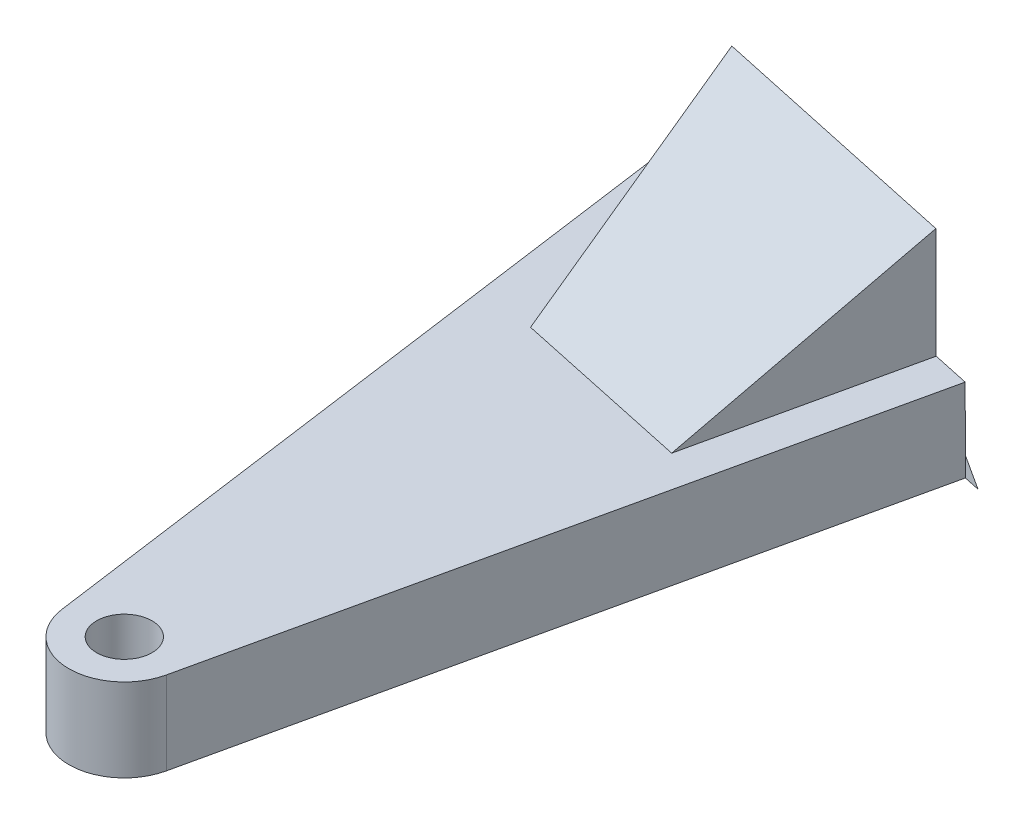
ISO-10303-21;
HEADER;
FILE_DESCRIPTION(('STEP AP214'),'2;1');
FILE_NAME('part.step','',(''),(''),'','','');
FILE_SCHEMA(('AUTOMOTIVE_DESIGN { 1 0 10303 214 1 1 1 1 }'));
ENDSEC;
DATA;
#1=APPLICATION_CONTEXT('core data for automotive mechanical design processes');
#2=APPLICATION_PROTOCOL_DEFINITION('international standard','automotive_design',2000,#1);
#3=PRODUCT_CONTEXT('',#1,'mechanical');
#4=PRODUCT('Part','Part','',(#3));
#5=PRODUCT_RELATED_PRODUCT_CATEGORY('part','',(#4));
#6=PRODUCT_DEFINITION_FORMATION('','',#4);
#7=PRODUCT_DEFINITION_CONTEXT('part definition',#1,'design');
#8=PRODUCT_DEFINITION('design','',#6,#7);
#9=PRODUCT_DEFINITION_SHAPE('','',#8);
#10=(LENGTH_UNIT() NAMED_UNIT(*) SI_UNIT(.MILLI.,.METRE.));
#11=(NAMED_UNIT(*) PLANE_ANGLE_UNIT() SI_UNIT($,.RADIAN.));
#12=(NAMED_UNIT(*) SI_UNIT($,.STERADIAN.) SOLID_ANGLE_UNIT());
#13=UNCERTAINTY_MEASURE_WITH_UNIT(LENGTH_MEASURE(1.E-05),#10,'distance_accuracy_value','');
#14=(GEOMETRIC_REPRESENTATION_CONTEXT(3) GLOBAL_UNCERTAINTY_ASSIGNED_CONTEXT((#13)) GLOBAL_UNIT_ASSIGNED_CONTEXT((#10,
#11,#12)) REPRESENTATION_CONTEXT('',''));
#15=CARTESIAN_POINT('',(0.,0.,0.));
#16=DIRECTION('',(0.,0.,1.));
#17=DIRECTION('',(1.,0.,0.));
#18=AXIS2_PLACEMENT_3D('',#15,#16,#17);
#19=CARTESIAN_POINT('',(-7.34839244947163,-0.0887410020213549,34.1678225960958));
#20=DIRECTION('',(0.210259223292456,0.00253914230731457,-0.977642374172067));
#21=DIRECTION('',(-0.977645525736604,0.,-0.210259901091955));
#22=AXIS2_PLACEMENT_3D('',#19,#20,#21);
#23=PLANE('',#22);
#24=CARTESIAN_POINT('',(-212.092343960492,296.750000000374,-10.5535272569263));
#25=CARTESIAN_POINT('',(-208.656682617701,296.750000000374,-9.60926234905713));
#26=CARTESIAN_POINT('',(-201.778980917961,296.750000000374,-7.71925467523142));
#27=CARTESIAN_POINT('',(-187.98045076051,296.750000000374,-4.17452292756473));
#28=CARTESIAN_POINT('',(-172.440713937594,296.750000000374,-0.524291087059107));
#29=CARTESIAN_POINT('',(-160.324034170556,296.750000000374,2.07306741468053));
#30=CARTESIAN_POINT('',(-155.153816591942,296.750000000374,3.13488778760624));
#31=B_SPLINE_CURVE_WITH_KNOTS('',3,(#24,#25,#26,#27,#28,#29,#30),.UNSPECIFIED.,.F.,.F.,(4,1,1,1,
4),(0.,0.0249064027026912,0.0498585513485383,0.0995828559657603,0.136477575807847),.UNSPECIFIED.);
#32=CARTESIAN_POINT('',(-171.178526339928,296.750000000374,-0.298805788811534));
#33=VERTEX_POINT('',#32);
#34=CARTESIAN_POINT('',(-170.325878436779,296.750006553501,-0.109828213624241));
#35=VERTEX_POINT('',#34);
#36=EDGE_CURVE('E217',#33,#35,#31,.T.);
#37=ORIENTED_EDGE('',*,*,#36,.F.);
#38=CARTESIAN_POINT('',(-156.947612160151,296.75000000038,2.76482621993605));
#39=CARTESIAN_POINT('',(-157.090321713305,296.933850041363,2.73461151079516));
#40=CARTESIAN_POINT('',(-157.234487025717,297.116533068292,2.70408068494826));
#41=CARTESIAN_POINT('',(-157.526727028967,297.479875542242,2.64217299770833));
#42=CARTESIAN_POINT('',(-157.674815517312,297.660523371295,2.61079313874722));
#43=CARTESIAN_POINT('',(-157.975080340306,298.018999896749,2.54714693532276));
#44=CARTESIAN_POINT('',(-158.127265735942,298.196820673787,2.51487862156538));
#45=CARTESIAN_POINT('',(-158.435989884384,298.548761381026,2.4493961160502));
#46=CARTESIAN_POINT('',(-158.592532432075,298.722877836298,2.41618109911061));
#47=CARTESIAN_POINT('',(-158.913572531429,299.069962988312,2.3480372204362));
#48=CARTESIAN_POINT('',(-159.07816669116,299.242838479293,2.31308733935822));
#49=CARTESIAN_POINT('',(-159.41281194895,299.582649124699,2.24199853814233));
#50=CARTESIAN_POINT('',(-159.582857473546,299.749590000083,2.20586083153433));
#51=CARTESIAN_POINT('',(-159.929104919618,300.076234137316,2.1322425790623));
#52=CARTESIAN_POINT('',(-160.105299033295,300.235946026192,2.09476373480923));
#53=CARTESIAN_POINT('',(-160.464787391662,300.546601387682,2.01825626457511));
#54=CARTESIAN_POINT('',(-160.648077013936,300.697550413867,1.97922864714946));
#55=CARTESIAN_POINT('',(-160.967608321068,300.945727011593,1.9111523745631));
#56=CARTESIAN_POINT('',(-161.101819050014,301.045689585218,1.88254761564029));
#57=CARTESIAN_POINT('',(-161.374621448913,301.23921584701,1.82437927997029));
#58=CARTESIAN_POINT('',(-161.513213574423,301.332778866564,1.79481560351126));
#59=CARTESIAN_POINT('',(-161.794922682772,301.51220593626,1.73469510443625));
#60=CARTESIAN_POINT('',(-161.938035274545,301.598077164717,1.70413924483996));
#61=CARTESIAN_POINT('',(-162.229127029123,301.760764968682,1.64195736694229));
#62=CARTESIAN_POINT('',(-162.37710619897,301.837581531083,1.61033134709194));
#63=CARTESIAN_POINT('',(-162.680366699878,301.9815541438,1.54548375854743));
#64=CARTESIAN_POINT('',(-162.83572631308,302.048539071767,1.51224490945824));
#65=CARTESIAN_POINT('',(-163.15133895024,302.169293862258,1.44468047475453));
#66=CARTESIAN_POINT('',(-163.311592262754,302.223062943815,1.41035482505279));
#67=CARTESIAN_POINT('',(-163.63585191083,302.314976866499,1.34085579246694));
#68=CARTESIAN_POINT('',(-163.799845473648,302.353168328017,1.30568527766964));
#69=CARTESIAN_POINT('',(-164.130809545588,302.411953400244,1.23465829799441));
#70=CARTESIAN_POINT('',(-164.297778540005,302.432555717764,1.19880218149421));
#71=CARTESIAN_POINT('',(-164.588595529967,302.451574652785,1.13630625838239));
#72=CARTESIAN_POINT('',(-164.712179154402,302.454415215012,1.10973479934985));
#73=CARTESIAN_POINT('',(-164.959122466627,302.449272101937,1.05661192999214));
#74=CARTESIAN_POINT('',(-165.082482186634,302.441290132148,1.03006051716761));
#75=CARTESIAN_POINT('',(-165.328075255399,302.41441837303,0.977171607612487));
#76=CARTESIAN_POINT('',(-165.450308400575,302.395526650014,0.950834149643489));
#77=CARTESIAN_POINT('',(-165.692735710868,302.347096407937,0.898570100341226));
#78=CARTESIAN_POINT('',(-165.812929764091,302.317557306577,0.872643531560296));
#79=CARTESIAN_POINT('',(-166.049947211265,302.24855357852,0.821489535011061));
#80=CARTESIAN_POINT('',(-166.166783634147,302.209135537374,0.796259426133777));
#81=CARTESIAN_POINT('',(-166.39710158318,302.121080590461,0.746496794725377));
#82=CARTESIAN_POINT('',(-166.510581739569,302.072439979184,0.721964557161904));
#83=CARTESIAN_POINT('',(-166.845290227822,301.914034005037,0.649568184060653));
#84=CARTESIAN_POINT('',(-167.060925569393,301.791742366034,0.60287438629407));
#85=CARTESIAN_POINT('',(-167.445921491939,301.540793815355,0.519422461661318));
#86=CARTESIAN_POINT('',(-167.617483799123,301.41556402046,0.482199715709858));
#87=CARTESIAN_POINT('',(-167.949253278245,301.150087454188,0.410157343535625));
#88=CARTESIAN_POINT('',(-168.1094520335,301.009829741131,0.375339499051212));
#89=CARTESIAN_POINT('',(-168.420272945214,300.716646455401,0.307730525349939));
#90=CARTESIAN_POINT('',(-168.570822429363,300.563641095171,0.274954818369235));
#91=CARTESIAN_POINT('',(-168.862290273911,300.248296514822,0.211450505325108));
#92=CARTESIAN_POINT('',(-169.003205972803,300.085954737977,0.18072246502504));
#93=CARTESIAN_POINT('',(-169.274416116645,299.756351945857,0.121537895988342));
#94=CARTESIAN_POINT('',(-169.404836499472,299.589198707277,0.093054562010334));
#95=CARTESIAN_POINT('',(-169.658311595216,299.249068927397,0.0376568868481627));
#96=CARTESIAN_POINT('',(-169.781363416372,299.076090140957,0.0107431617569933));
#97=CARTESIAN_POINT('',(-170.020947084012,298.725336548071,-0.0416945092287366));
#98=CARTESIAN_POINT('',(-170.137475058248,298.547558984157,-0.067217629490014));
#99=CARTESIAN_POINT('',(-170.361851471542,298.192563178041,-0.11639573032197));
#100=CARTESIAN_POINT('',(-170.469843130054,298.015439377228,-0.140081267476274));
#101=CARTESIAN_POINT('',(-170.680742893625,297.658238521361,-0.18636670423898));
#102=CARTESIAN_POINT('',(-170.783654660642,297.478163722123,-0.208967385557368));
#103=CARTESIAN_POINT('',(-170.98476461908,297.115749877763,-0.253160891407718));
#104=CARTESIAN_POINT('',(-171.082971782624,296.933416051361,-0.274755631998877));
#105=CARTESIAN_POINT('',(-171.179172711447,296.750000637104,-0.295921705564243));
#106=B_SPLINE_CURVE_WITH_KNOTS('',3,(#38,#39,#40,#41,#42,#43,#44,#45,#46,#47,#48,#49,#50,#51,
#52,#53,#54,#55,#56,#57,#58,#59,#60,#61,#62,#63,#64,#65,#66,#67,#68,#69,#70,#71,#72,#73,#74,#75,
#76,#77,#78,#79,#80,#81,#82,#83,#84,#85,#86,#87,#88,#89,#90,#91,#92,#93,#94,#95,#96,#97,#98,#99,
#100,#101,#102,#103,#104,#105),.UNSPECIFIED.,.F.,.F.,(4,2,2,2,2,2,2,2,2,2,2,2,2,2,2,2,2,2,2,2,2,
2,2,2,2,2,2,2,2,2,2,2,2,4),(0.,0.704082280602327,1.41110117641958,2.11983854158573,
2.82921379347308,3.55282928263287,4.27572716934958,4.99773829223296,5.71928672077186,
6.228459807425,6.73768601062706,7.24643191962628,7.755178565031,8.27193434708673,
8.78872065852737,9.30394878898145,9.81892172798588,10.197813368201,10.5766453061594,
10.955544410368,11.3344642395557,11.7116297761201,12.0889471752451,12.843141566047,
13.4891920305164,14.1357161162784,14.7866444759381,15.4377519455241,16.0792623920878,
16.7210229686585,17.3631605111951,17.9894531704851,18.6152875536356,19.2398765773958),.UNSPECIFIED.);
#107=CARTESIAN_POINT('',(-170.324959635602,298.249999997736,-0.10831231532468));
#108=VERTEX_POINT('',#107);
#109=EDGE_CURVE('E145',#108,#33,#106,.T.);
#110=ORIENTED_EDGE('',*,*,#109,.F.);
#111=DIRECTION('',(-0.000368613635867174,-0.999996350290417,-0.00267647713119119));
#112=VECTOR('',#111,1.);
#113=CARTESIAN_POINT('',(-170.324380417459,299.821336410984,-0.104106653999674));
#114=LINE('',#113,#112);
#115=CARTESIAN_POINT('',(-170.324406713129,299.750000000374,-0.104297584968138));
#116=VERTEX_POINT('',#115);
#117=EDGE_CURVE('E373',#116,#108,#114,.T.);
#118=ORIENTED_EDGE('',*,*,#117,.F.);
#119=DIRECTION('',(0.977645525736604,0.,0.210259901091955));
#120=VECTOR('',#119,1.);
#121=CARTESIAN_POINT('',(-159.666777763632,299.750000000374,2.18781335893206));
#122=LINE('',#121,#120);
#123=CARTESIAN_POINT('',(-169.277158619519,299.750000000374,0.120931575074583));
#124=VERTEX_POINT('',#123);
#125=EDGE_CURVE('E144',#116,#124,#122,.T.);
#126=ORIENTED_EDGE('',*,*,#125,.T.);
#127=CARTESIAN_POINT('',(-167.532882539393,301.474123593619,0.500546799187491));
#128=VERTEX_POINT('',#127);
#129=EDGE_CURVE('E130',#128,#124,#106,.T.);
#130=ORIENTED_EDGE('',*,*,#129,.F.);
#131=DIRECTION('',(-0.914137121621333,0.355053506846356,-0.195679151035488));
#132=VECTOR('',#131,1.);
#133=CARTESIAN_POINT('',(-160.690213845434,298.816411245531,1.96528066589246));
#134=LINE('',#133,#132);
#135=CARTESIAN_POINT('',(-168.243166650192,301.750000000376,0.348504191456231));
#136=VERTEX_POINT('',#135);
#137=EDGE_CURVE('E142',#128,#136,#134,.T.);
#138=ORIENTED_EDGE('',*,*,#137,.T.);
#139=DIRECTION('',(0.000368613635867168,0.999996350290417,0.00267647713119119));
#140=VECTOR('',#139,1.);
#141=CARTESIAN_POINT('',(-168.242429425611,303.749985401562,0.35385712618187));
#142=LINE('',#141,#140);
#143=CARTESIAN_POINT('',(-168.242430355375,303.747463085137,0.353850375235023));
#144=VERTEX_POINT('',#143);
#145=EDGE_CURVE('E169',#136,#144,#142,.T.);
#146=ORIENTED_EDGE('',*,*,#145,.T.);
#147=DIRECTION('',(-0.977645669475758,0.000481590385637427,-0.210258681214348));
#148=VECTOR('',#147,1.);
#149=CARTESIAN_POINT('',(-7.36754546636496,303.668215766531,34.9526239323372));
#150=LINE('',#149,#148);
#151=CARTESIAN_POINT('',(-158.861069546441,303.742841806374,2.37146535913816));
#152=VERTEX_POINT('',#151);
#153=EDGE_CURVE('E203',#152,#144,#150,.T.);
#154=ORIENTED_EDGE('',*,*,#153,.F.);
#155=DIRECTION('',(0.00055326334025518,-0.999996776176426,-0.00247821234571721));
#156=VECTOR('',#155,1.);
#157=CARTESIAN_POINT('',(-158.86108472554,303.770277294104,2.37153335032177));
#158=LINE('',#157,#156);
#159=CARTESIAN_POINT('',(-158.858860446325,299.750000000374,2.36157021737986));
#160=VERTEX_POINT('',#159);
#161=EDGE_CURVE('E166',#152,#160,#158,.T.);
#162=ORIENTED_EDGE('',*,*,#161,.T.);
#163=CARTESIAN_POINT('',(-157.527209753028,299.750000000374,2.64796516901712));
#164=VERTEX_POINT('',#163);
#165=EDGE_CURVE('E153',#160,#164,#122,.T.);
#166=ORIENTED_EDGE('',*,*,#165,.T.);
#167=DIRECTION('',(-0.000553263340255178,0.999996776176426,0.00247821234571721));
#168=VECTOR('',#167,1.);
#169=CARTESIAN_POINT('',(-157.527243677342,299.811316560531,2.64811712496337));
#170=LINE('',#169,#168);
#171=CARTESIAN_POINT('',(-157.526407114589,298.299269774182,2.64436993986988));
#172=VERTEX_POINT('',#171);
#173=EDGE_CURVE('E177',#172,#164,#170,.T.);
#174=ORIENTED_EDGE('',*,*,#173,.F.);
#175=DIRECTION('',(0.967751125381758,0.141371431455984,0.208499107169375));
#176=VECTOR('',#175,1.);
#177=CARTESIAN_POINT('',(-169.871349092754,296.495890710163,-0.0153111630476919));
#178=LINE('',#177,#176);
#179=CARTESIAN_POINT('',(-158.139621558857,298.209689920951,2.51225470819525));
#180=VERTEX_POINT('',#179);
#181=EDGE_CURVE('E372',#180,#172,#178,.T.);
#182=ORIENTED_EDGE('',*,*,#181,.F.);
#183=CARTESIAN_POINT('',(-156.947599737945,296.750000000374,2.76476639497491));
#184=VERTEX_POINT('',#183);
#185=EDGE_CURVE('E146',#184,#180,#106,.T.);
#186=ORIENTED_EDGE('',*,*,#185,.F.);
#187=CARTESIAN_POINT('',(-157.526021102111,296.750001336041,2.64258129232908));
#188=VERTEX_POINT('',#187);
#189=EDGE_CURVE('E237',#188,#184,#31,.T.);
#190=ORIENTED_EDGE('',*,*,#189,.F.);
#191=DIRECTION('',(-0.977645525736604,0.,-0.210259901091955));
#192=VECTOR('',#191,1.);
#193=CARTESIAN_POINT('',(-157.023870813196,296.750000000374,2.7484254500101));
#194=LINE('',#193,#192);
#195=EDGE_CURVE('E150',#188,#35,#194,.T.);
#196=ORIENTED_EDGE('',*,*,#195,.T.);
#197=EDGE_LOOP('',(#37,#110,#118,#126,#130,#138,#146,#154,#162,#166,#174,#182,#186,#190,#196));
#198=FACE_BOUND('',#197,.T.);
#199=ADVANCED_FACE('F42',(#198),#23,.T.);
#200=CARTESIAN_POINT('',(-164.740669088693,299.750000000374,25.7798873885401));
#201=DIRECTION('',(0.,-1.,0.));
#202=DIRECTION('',(0.,0.,-1.));
#203=AXIS2_PLACEMENT_3D('',#200,#201,#202);
#204=CYLINDRICAL_SURFACE('',#203,0.999999999999998);
#205=CARTESIAN_POINT('',(-164.740669088693,299.750000000374,25.7798873885401));
#206=DIRECTION('',(0.,-1.,0.));
#207=DIRECTION('',(0.,0.,-1.));
#208=AXIS2_PLACEMENT_3D('',#205,#206,#207);
#209=CIRCLE('',#208,0.999999999999998);
#210=CARTESIAN_POINT('',(-164.740669088693,299.750000000374,24.7798873885401));
#211=VERTEX_POINT('',#210);
#212=EDGE_CURVE('E337',#211,#211,#209,.T.);
#213=ORIENTED_EDGE('',*,*,#212,.F.);
#214=EDGE_LOOP('',(#213));
#215=FACE_BOUND('',#214,.T.);
#216=CARTESIAN_POINT('',(-164.740669088693,296.750000000374,25.7798873885401));
#217=DIRECTION('',(0.,-1.,0.));
#218=DIRECTION('',(0.,0.,-1.));
#219=AXIS2_PLACEMENT_3D('',#216,#217,#218);
#220=CIRCLE('',#219,0.999999999999998);
#221=CARTESIAN_POINT('',(-164.740669088693,296.750000000374,24.7798873885401));
#222=VERTEX_POINT('',#221);
#223=EDGE_CURVE('E137',#222,#222,#220,.T.);
#224=ORIENTED_EDGE('',*,*,#223,.T.);
#225=EDGE_LOOP('',(#224));
#226=FACE_BOUND('',#225,.T.);
#227=ADVANCED_FACE('F191',(#215,#226),#204,.F.);
#228=CARTESIAN_POINT('',(-164.740669088693,299.750000000374,25.7798873885401));
#229=DIRECTION('',(0.,-1.,0.));
#230=DIRECTION('',(0.,0.,-1.));
#231=AXIS2_PLACEMENT_3D('',#228,#229,#230);
#232=CYLINDRICAL_SURFACE('',#231,2.00000000000002);
#233=CARTESIAN_POINT('',(-164.740669088693,296.750000000374,25.7798873885401));
#234=DIRECTION('',(0.,-1.,0.));
#235=DIRECTION('',(0.,0.,-1.));
#236=AXIS2_PLACEMENT_3D('',#233,#234,#235);
#237=CIRCLE('',#236,2.00000000000002);
#238=CARTESIAN_POINT('',(-162.788721147831,296.750000000374,26.2156616835201));
#239=VERTEX_POINT('',#238);
#240=CARTESIAN_POINT('',(-166.721966978998,296.750000000374,26.052758548383));
#241=VERTEX_POINT('',#240);
#242=EDGE_CURVE('E342',#239,#241,#237,.T.);
#243=ORIENTED_EDGE('',*,*,#242,.F.);
#244=DIRECTION('',(0.,-1.,0.));
#245=VECTOR('',#244,1.);
#246=CARTESIAN_POINT('',(-162.788721147831,299.750000000374,26.2156616835201));
#247=LINE('',#246,#245);
#248=CARTESIAN_POINT('',(-162.788721147831,299.750000000374,26.2156616835201));
#249=VERTEX_POINT('',#248);
#250=EDGE_CURVE('E261',#249,#239,#247,.T.);
#251=ORIENTED_EDGE('',*,*,#250,.F.);
#252=CARTESIAN_POINT('',(-164.740669088693,299.750000000374,25.7798873885401));
#253=DIRECTION('',(0.,-1.,0.));
#254=DIRECTION('',(0.,0.,-1.));
#255=AXIS2_PLACEMENT_3D('',#252,#253,#254);
#256=CIRCLE('',#255,2.00000000000002);
#257=CARTESIAN_POINT('',(-166.721966978998,299.750000000374,26.052758548383));
#258=VERTEX_POINT('',#257);
#259=EDGE_CURVE('E345',#249,#258,#256,.T.);
#260=ORIENTED_EDGE('',*,*,#259,.T.);
#261=DIRECTION('',(0.,-1.,0.));
#262=VECTOR('',#261,1.);
#263=CARTESIAN_POINT('',(-166.721966978998,299.750000000374,26.052758548383));
#264=LINE('',#263,#262);
#265=EDGE_CURVE('E260',#258,#241,#264,.T.);
#266=ORIENTED_EDGE('',*,*,#265,.T.);
#267=EDGE_LOOP('',(#243,#251,#260,#266));
#268=FACE_BOUND('',#267,.T.);
#269=ADVANCED_FACE('F328',(#268),#232,.T.);
#270=CARTESIAN_POINT('',(-155.797653964247,296.750000000374,-2.95311540362879));
#271=DIRECTION('',(0.,1.,0.));
#272=DIRECTION('',(0.,0.,1.));
#273=AXIS2_PLACEMENT_3D('',#270,#271,#272);
#274=PLANE('',#273);
#275=ORIENTED_EDGE('',*,*,#223,.F.);
#276=EDGE_LOOP('',(#275));
#277=FACE_BOUND('',#276,.T.);
#278=ORIENTED_EDGE('',*,*,#195,.F.);
#279=DIRECTION('',(-0.217887147489957,0.,0.975973970430918));
#280=VECTOR('',#279,1.);
#281=CARTESIAN_POINT('',(-162.788721147831,296.750000000374,26.2156616835201));
#282=LINE('',#281,#280);
#283=EDGE_CURVE('E363',#188,#239,#282,.T.);
#284=ORIENTED_EDGE('',*,*,#283,.T.);
#285=ORIENTED_EDGE('',*,*,#242,.T.);
#286=DIRECTION('',(-0.136435579921459,0.,-0.990648945152366));
#287=VECTOR('',#286,1.);
#288=CARTESIAN_POINT('',(-166.721966978998,296.750000000374,26.052758548383));
#289=LINE('',#288,#287);
#290=EDGE_CURVE('E358',#241,#35,#289,.T.);
#291=ORIENTED_EDGE('',*,*,#290,.T.);
#292=EDGE_LOOP('',(#278,#284,#285,#291));
#293=FACE_BOUND('',#292,.T.);
#294=ADVANCED_FACE('F44',(#277,#293),#274,.F.);
#295=CARTESIAN_POINT('',(-212.092343960492,296.750000000374,-10.5535272569263));
#296=CARTESIAN_POINT('',(-212.087527337641,475.75,-10.6127897617149));
#297=CARTESIAN_POINT('',(-209.970330680509,296.750000000374,-9.97030834376852));
#298=CARTESIAN_POINT('',(-209.917450192457,475.75,-10.0020687228902));
#299=CARTESIAN_POINT('',(-207.848011822886,296.750000000373,-9.38830558070099));
#300=CARTESIAN_POINT('',(-207.745692388938,475.75,-9.39710442005081));
#301=CARTESIAN_POINT('',(-201.530806538914,296.750000000374,-7.66944264400084));
#302=CARTESIAN_POINT('',(-201.27640755277,475.75,-7.62937900022617));
#303=CARTESIAN_POINT('',(-197.326478066482,296.750000000375,-6.56842062351586));
#304=CARTESIAN_POINT('',(-196.97050426276,475.75,-6.497778057561));
#305=CARTESIAN_POINT('',(-180.530895585007,296.750000000376,-2.32619047400165));
#306=CARTESIAN_POINT('',(-179.725161090468,475.750000000001,-2.30736869871735));
#307=CARTESIAN_POINT('',(-167.865975525615,296.750000000374,0.524160263202395));
#308=CARTESIAN_POINT('',(-166.724767391033,475.75,0.505970437889461));
#309=CARTESIAN_POINT('',(-155.153816591942,296.750000000374,3.13488778760624));
#310=CARTESIAN_POINT('',(-153.625033964382,475.75,2.77034786214404));
#311=B_SPLINE_SURFACE_WITH_KNOTS('',3,1,((#295,#296),(#297,#298),(#299,#300),(#301,#302),(#303,
#304),(#305,#306),(#307,#308),(#309,#310)),.UNSPECIFIED.,.F.,.F.,.F.,(4,2,2,4),(2,2),(0.,
0.112716179565585,0.335315747661667,1.),(0.,1.),.UNSPECIFIED.);
#312=CARTESIAN_POINT('',(-170.325339726378,299.750000000374,-0.111072127146473));
#313=CARTESIAN_POINT('',(-170.325086202253,298.750000000374,-0.109231306684116));
#314=CARTESIAN_POINT('',(-170.324832678127,297.750000000374,-0.107390486221758));
#315=CARTESIAN_POINT('',(-170.324579154002,296.750000000374,-0.105549665759401));
#316=B_SPLINE_CURVE_WITH_KNOTS('',3,(#312,#313,#314,#315),.UNSPECIFIED.,.F.,.F.,(4,4),(0.,
3.00000517933655),.UNSPECIFIED.);
#317=EDGE_CURVE('E262',#108,#35,#316,.T.);
#318=ORIENTED_EDGE('',*,*,#317,.F.);
#319=ORIENTED_EDGE('',*,*,#109,.T.);
#320=ORIENTED_EDGE('',*,*,#36,.T.);
#321=EDGE_LOOP('',(#318,#319,#320));
#322=FACE_BOUND('',#321,.T.);
#323=ADVANCED_FACE('F374',(#322),#311,.T.);
#324=CARTESIAN_POINT('',(-164.740669088693,299.750000000374,25.7798873885401));
#325=DIRECTION('',(0.,-1.,0.));
#326=DIRECTION('',(0.,0.,-1.));
#327=AXIS2_PLACEMENT_3D('',#324,#325,#326);
#328=PLANE('',#327);
#329=ORIENTED_EDGE('',*,*,#212,.T.);
#330=EDGE_LOOP('',(#329));
#331=FACE_BOUND('',#330,.T.);
#332=ORIENTED_EDGE('',*,*,#125,.F.);
#333=DIRECTION('',(-0.136435579921459,0.,-0.990648945152366));
#334=VECTOR('',#333,1.);
#335=CARTESIAN_POINT('',(-166.721966978998,299.750000000374,26.052758548383));
#336=LINE('',#335,#334);
#337=EDGE_CURVE('E348',#258,#116,#336,.T.);
#338=ORIENTED_EDGE('',*,*,#337,.F.);
#339=ORIENTED_EDGE('',*,*,#259,.F.);
#340=DIRECTION('',(-0.217887147489957,0.,0.975973970430918));
#341=VECTOR('',#340,1.);
#342=CARTESIAN_POINT('',(-162.788721147831,299.750000000374,26.2156616835201));
#343=LINE('',#342,#341);
#344=EDGE_CURVE('E350',#164,#249,#343,.T.);
#345=ORIENTED_EDGE('',*,*,#344,.F.);
#346=ORIENTED_EDGE('',*,*,#165,.F.);
#347=DIRECTION('',(0.217887147489958,0.,-0.975973970430918));
#348=VECTOR('',#347,1.);
#349=CARTESIAN_POINT('',(-160.601047369418,299.750000000374,10.1652847005479));
#350=LINE('',#349,#348);
#351=CARTESIAN_POINT('',(-160.601047369418,299.750000000374,10.1652847005479));
#352=VERTEX_POINT('',#351);
#353=EDGE_CURVE('E298',#352,#160,#350,.T.);
#354=ORIENTED_EDGE('',*,*,#353,.F.);
#355=DIRECTION('',(0.977847838766361,0.,0.20931699457989));
#356=VECTOR('',#355,1.);
#357=CARTESIAN_POINT('',(-167.082237334523,299.750000000374,8.7779285588104));
#358=LINE('',#357,#356);
#359=CARTESIAN_POINT('',(-167.082237334523,299.750000000374,8.7779285588104));
#360=VERTEX_POINT('',#359);
#361=EDGE_CURVE('E61',#360,#352,#358,.T.);
#362=ORIENTED_EDGE('',*,*,#361,.F.);
#363=DIRECTION('',(0.136435579921458,0.,0.990648945152366));
#364=VECTOR('',#363,1.);
#365=CARTESIAN_POINT('',(-168.243166650192,299.750000000374,0.348504191456231));
#366=LINE('',#365,#364);
#367=CARTESIAN_POINT('',(-168.243166650192,299.750000000374,0.34850419145622));
#368=VERTEX_POINT('',#367);
#369=EDGE_CURVE('E380',#368,#360,#366,.T.);
#370=ORIENTED_EDGE('',*,*,#369,.F.);
#371=CARTESIAN_POINT('',(-170.402426030242,299.750000000374,-0.128186687817729));
#372=CARTESIAN_POINT('',(-169.683942490642,299.750000000374,0.0313632400164765));
#373=CARTESIAN_POINT('',(-168.965260608667,299.750000000374,0.190019596135018));
#374=CARTESIAN_POINT('',(-167.527519391208,299.750000000374,0.505573882671323));
#375=CARTESIAN_POINT('',(-166.808460060072,299.750000000374,0.66247183289984));
#376=CARTESIAN_POINT('',(-165.36997086277,299.750000000374,0.974540778074555));
#377=CARTESIAN_POINT('',(-164.650540998631,299.750000000374,1.12971178236438));
#378=CARTESIAN_POINT('',(-163.211317870577,299.750000000374,1.4383581949192));
#379=CARTESIAN_POINT('',(-162.491524606763,299.750000000374,1.59183360364918));
#380=CARTESIAN_POINT('',(-161.051581021105,299.750000000374,1.89712030026383));
#381=CARTESIAN_POINT('',(-160.331430697254,299.750000000374,2.04893157867901));
#382=CARTESIAN_POINT('',(-158.890779555056,299.750000000374,2.35092137760546));
#383=CARTESIAN_POINT('',(-158.170278732961,299.750000000374,2.50109988024438));
#384=CARTESIAN_POINT('',(-157.449611773144,299.750000000374,2.65047646045346));
#385=B_SPLINE_CURVE_WITH_KNOTS('',3,(#371,#372,#373,#374,#375,#376,#377,#378,#379,#380,#381,
#382,#383,#384),.UNSPECIFIED.,.F.,.F.,(4,2,2,2,2,2,4),(0.,2.20795604879195,4.41588719700042,
6.62380639339768,8.83172498428756,11.0396561324936,13.2476114243984),.UNSPECIFIED.);
#386=EDGE_CURVE('E132',#124,#368,#385,.T.);
#387=ORIENTED_EDGE('',*,*,#386,.F.);
#388=EDGE_LOOP('',(#332,#338,#339,#345,#346,#354,#362,#370,#387));
#389=FACE_BOUND('',#388,.T.);
#390=ADVANCED_FACE('F323',(#331,#389),#328,.F.);
#391=CARTESIAN_POINT('',(-168.243166650192,303.750000000374,0.348504191456231));
#392=DIRECTION('',(0.990648945152366,0.,-0.136435579921458));
#393=DIRECTION('',(-0.136435579921458,0.,-0.990648945152366));
#394=AXIS2_PLACEMENT_3D('',#391,#392,#393);
#395=PLANE('',#394);
#396=ORIENTED_EDGE('',*,*,#145,.F.);
#397=DIRECTION('',(0.,-1.,0.));
#398=VECTOR('',#397,1.);
#399=CARTESIAN_POINT('',(-168.243166650192,303.750000000374,0.348504191456231));
#400=LINE('',#399,#398);
#401=EDGE_CURVE('E136',#136,#368,#400,.T.);
#402=ORIENTED_EDGE('',*,*,#401,.T.);
#403=ORIENTED_EDGE('',*,*,#369,.T.);
#404=DIRECTION('',(0.123473112023333,-0.425428526463464,0.896529396884675));
#405=VECTOR('',#404,1.);
#406=CARTESIAN_POINT('',(-167.082237334523,299.750000000374,8.7779285588104));
#407=LINE('',#406,#405);
#408=EDGE_CURVE('E11',#144,#360,#407,.T.);
#409=ORIENTED_EDGE('',*,*,#408,.F.);
#410=EDGE_LOOP('',(#396,#402,#403,#409));
#411=FACE_BOUND('',#410,.T.);
#412=ADVANCED_FACE('F318',(#411),#395,.F.);
#413=CARTESIAN_POINT('',(-160.601047369418,303.750000000374,10.1652847005479));
#414=DIRECTION('',(-0.975973970430918,0.,-0.217887147489958));
#415=DIRECTION('',(-0.217887147489958,0.,0.975973970430918));
#416=AXIS2_PLACEMENT_3D('',#413,#414,#415);
#417=PLANE('',#416);
#418=ORIENTED_EDGE('',*,*,#161,.F.);
#419=DIRECTION('',(0.194884189284424,0.447213595499959,-0.872937656861561));
#420=VECTOR('',#419,1.);
#421=CARTESIAN_POINT('',(-158.857950189498,303.750000000374,2.35749293710055));
#422=LINE('',#421,#420);
#423=EDGE_CURVE('E51',#352,#152,#422,.T.);
#424=ORIENTED_EDGE('',*,*,#423,.F.);
#425=ORIENTED_EDGE('',*,*,#353,.T.);
#426=EDGE_LOOP('',(#418,#424,#425));
#427=FACE_BOUND('',#426,.T.);
#428=ADVANCED_FACE('F316',(#427),#417,.F.);
#429=CARTESIAN_POINT('',(-26.9212279449058,257.219363242293,125.765538606639));
#430=DIRECTION('',(-0.0936122874538247,0.894420307268477,0.43732031005137));
#431=DIRECTION('',(0.,-0.439249172562715,0.898365273373237));
#432=AXIS2_PLACEMENT_3D('',#429,#430,#431);
#433=PLANE('',#432);
#434=ORIENTED_EDGE('',*,*,#423,.T.);
#435=ORIENTED_EDGE('',*,*,#153,.T.);
#436=ORIENTED_EDGE('',*,*,#408,.T.);
#437=ORIENTED_EDGE('',*,*,#361,.T.);
#438=EDGE_LOOP('',(#434,#435,#436,#437));
#439=FACE_BOUND('',#438,.T.);
#440=ADVANCED_FACE('F314',(#439),#433,.T.);
#441=CARTESIAN_POINT('',(-168.243166650192,299.750000000371,0.34850419145623));
#442=CARTESIAN_POINT('',(-168.190519423152,299.893581237135,0.359773796910385));
#443=CARTESIAN_POINT('',(-168.136722624385,300.036729234372,0.371289478378812));
#444=CARTESIAN_POINT('',(-168.026724318357,300.321451407699,0.394835590477256));
#445=CARTESIAN_POINT('',(-167.970532291019,300.463029418501,0.406863991845413));
#446=CARTESIAN_POINT('',(-167.855449752964,300.744486158077,0.431498428860305));
#447=CARTESIAN_POINT('',(-167.79656881068,300.884368965489,0.444102416299241));
#448=CARTESIAN_POINT('',(-167.675733118114,301.162269362101,0.469968367015765));
#449=CARTESIAN_POINT('',(-167.61378753417,301.300291108266,0.483228368157688));
#450=CARTESIAN_POINT('',(-167.486359264282,301.574267018157,0.510505518466754));
#451=CARTESIAN_POINT('',(-167.420884282411,301.710224916297,0.52452101850903));
#452=CARTESIAN_POINT('',(-167.285519004015,301.980391313698,0.553497155818959));
#453=CARTESIAN_POINT('',(-167.215615000667,302.114592659237,0.568460727153682));
#454=CARTESIAN_POINT('',(-167.07089971601,302.380250898352,0.59943831615409));
#455=CARTESIAN_POINT('',(-166.996087429137,302.511707222236,0.615452549069433));
#456=CARTESIAN_POINT('',(-166.84062262235,302.771251291889,0.648731168532981));
#457=CARTESIAN_POINT('',(-166.75996135006,302.899333581418,0.665997428604866));
#458=CARTESIAN_POINT('',(-166.59151997562,303.15131812909,0.70205379735957));
#459=CARTESIAN_POINT('',(-166.50371268667,303.275201616132,0.720849725618158));
#460=CARTESIAN_POINT('',(-166.365540859281,303.456713200555,0.750426629608946));
#461=CARTESIAN_POINT('',(-166.318190725724,303.516744883265,0.760562345265419));
#462=CARTESIAN_POINT('',(-166.221218789904,303.634891201723,0.781320047394239));
#463=CARTESIAN_POINT('',(-166.171596184191,303.693005146749,0.791942205852208));
#464=CARTESIAN_POINT('',(-166.120746473587,303.750000000374,0.802827036985331));
#465=B_SPLINE_CURVE_WITH_KNOTS('',3,(#441,#442,#443,#444,#445,#446,#447,#448,#449,#450,#451,
#452,#453,#454,#455,#456,#457,#458,#459,#460,#461,#462,#463,#464),.UNSPECIFIED.,.F.,.F.,(4,2,2,
2,2,2,2,2,2,2,2,4),(0.,0.460036666619034,0.918396496871528,1.37523605037309,1.83078329919971,
2.28537354157956,2.74144674433259,3.19761367661445,3.6544778897114,4.11316970521717,
4.34449814165938,4.57590900721161),.UNSPECIFIED.);
#466=EDGE_CURVE('E127',#368,#128,#465,.T.);
#467=ORIENTED_EDGE('',*,*,#466,.T.);
#468=ORIENTED_EDGE('',*,*,#129,.T.);
#469=ORIENTED_EDGE('',*,*,#386,.T.);
#470=EDGE_LOOP('',(#467,#468,#469));
#471=FACE_BOUND('',#470,.T.);
#472=ADVANCED_FACE('F129',(#471),#311,.T.);
#473=CARTESIAN_POINT('',(-158.857950189498,303.750000000374,2.35749293710058));
#474=DIRECTION('',(-0.209316994579889,0.,0.977847838766361));
#475=DIRECTION('',(0.977847838766361,0.,0.209316994579889));
#476=AXIS2_PLACEMENT_3D('',#473,#474,#475);
#477=PLANE('',#476);
#478=ORIENTED_EDGE('',*,*,#137,.F.);
#479=ORIENTED_EDGE('',*,*,#466,.F.);
#480=ORIENTED_EDGE('',*,*,#401,.F.);
#481=EDGE_LOOP('',(#478,#479,#480));
#482=FACE_BOUND('',#481,.T.);
#483=ADVANCED_FACE('F148',(#482),#477,.F.);
#484=CARTESIAN_POINT('',(-166.721966978998,299.750000000374,26.052758548383));
#485=DIRECTION('',(-0.990648945152366,0.,0.136435579921459));
#486=DIRECTION('',(0.13643557992146,0.,0.990648945152366));
#487=AXIS2_PLACEMENT_3D('',#484,#485,#486);
#488=PLANE('',#487);
#489=ORIENTED_EDGE('',*,*,#337,.T.);
#490=ORIENTED_EDGE('',*,*,#117,.T.);
#491=ORIENTED_EDGE('',*,*,#317,.T.);
#492=ORIENTED_EDGE('',*,*,#290,.F.);
#493=ORIENTED_EDGE('',*,*,#265,.F.);
#494=EDGE_LOOP('',(#489,#490,#491,#492,#493));
#495=FACE_BOUND('',#494,.T.);
#496=ADVANCED_FACE('F310',(#495),#488,.T.);
#497=CARTESIAN_POINT('',(-162.788721147831,299.750000000374,26.2156616835201));
#498=DIRECTION('',(0.975973970430917,0.,0.217887147489957));
#499=DIRECTION('',(0.217887147489957,0.,-0.975973970430918));
#500=AXIS2_PLACEMENT_3D('',#497,#498,#499);
#501=PLANE('',#500);
#502=DIRECTION('',(0.,-1.,0.));
#503=VECTOR('',#502,1.);
#504=CARTESIAN_POINT('',(-157.526407114589,299.750000000374,2.64436993986988));
#505=LINE('',#504,#503);
#506=CARTESIAN_POINT('',(-157.526407114589,296.848539547987,2.64436993986988));
#507=VERTEX_POINT('',#506);
#508=EDGE_CURVE('E257',#172,#507,#505,.T.);
#509=ORIENTED_EDGE('',*,*,#508,.F.);
#510=ORIENTED_EDGE('',*,*,#173,.T.);
#511=ORIENTED_EDGE('',*,*,#344,.T.);
#512=ORIENTED_EDGE('',*,*,#250,.T.);
#513=ORIENTED_EDGE('',*,*,#283,.F.);
#514=CARTESIAN_POINT('',(-157.526478313823,296.750000000374,2.64468886000808));
#515=CARTESIAN_POINT('',(-157.526454580745,296.782846516245,2.64458255329535));
#516=CARTESIAN_POINT('',(-157.526430847667,296.815693032117,2.64447624658261));
#517=CARTESIAN_POINT('',(-157.526407114589,296.848539547988,2.64436993986987));
#518=B_SPLINE_CURVE_WITH_KNOTS('',3,(#514,#515,#516,#517),.UNSPECIFIED.,.F.,.F.,(4,4),(0.,
0.0985400894229964),.UNSPECIFIED.);
#519=EDGE_CURVE('E220',#188,#507,#518,.T.);
#520=ORIENTED_EDGE('',*,*,#519,.T.);
#521=EDGE_LOOP('',(#509,#510,#511,#512,#513,#520));
#522=FACE_BOUND('',#521,.T.);
#523=ADVANCED_FACE('F194',(#522),#501,.T.);
#524=CARTESIAN_POINT('',(-157.526407114589,296.848539547987,2.64436993986988));
#525=CARTESIAN_POINT('',(-157.598460526053,297.010651414674,2.62884624626246));
#526=CARTESIAN_POINT('',(-157.670776504244,297.172641432344,2.61326598343293));
#527=CARTESIAN_POINT('',(-157.815985890868,297.496343135951,2.58198105214267));
#528=CARTESIAN_POINT('',(-157.888879277876,297.658054831947,2.56627638829776));
#529=CARTESIAN_POINT('',(-158.03529947188,297.98117365961,2.53473059215166));
#530=CARTESIAN_POINT('',(-158.108826264815,298.142580797942,2.51888946287997));
#531=CARTESIAN_POINT('',(-158.256577026776,298.465061902685,2.48705699981743));
#532=CARTESIAN_POINT('',(-158.3308009993,298.626135867419,2.47106566527293));
#533=CARTESIAN_POINT('',(-158.480014134151,298.947916099993,2.43891813831239));
#534=CARTESIAN_POINT('',(-158.555003309563,299.108622361487,2.42276194307717));
#535=CARTESIAN_POINT('',(-158.705825484016,299.429628473896,2.39026775331066));
#536=CARTESIAN_POINT('',(-158.78165851941,299.589928306934,2.37392975094735));
#537=CARTESIAN_POINT('',(-158.857950189518,299.750000000374,2.35749293709631));
#538=B_SPLINE_CURVE_WITH_KNOTS('',3,(#524,#525,#526,#527,#528,#529,#530,#531,#532,#533,#534,
#535,#536,#537),.UNSPECIFIED.,.F.,.F.,(4,2,2,2,2,2,4),(0.,0.534243910687136,1.06846809060283,
1.60268044133954,2.13689547391784,2.6711196571007,3.20536694376372),.UNSPECIFIED.);
#539=EDGE_CURVE('E223',#507,#180,#538,.T.);
#540=ORIENTED_EDGE('',*,*,#189,.T.);
#541=ORIENTED_EDGE('',*,*,#185,.T.);
#542=ORIENTED_EDGE('',*,*,#539,.F.);
#543=ORIENTED_EDGE('',*,*,#519,.F.);
#544=EDGE_LOOP('',(#540,#541,#542,#543));
#545=FACE_BOUND('',#544,.T.);
#546=ADVANCED_FACE('F181',(#545),#311,.T.);
#547=CARTESIAN_POINT('',(-170.325630688797,299.750000000374,-0.113184784368472));
#548=DIRECTION('',(0.210614386541598,0.,-0.977569220148479));
#549=DIRECTION('',(-0.977569220148479,0.,-0.210614386541598));
#550=AXIS2_PLACEMENT_3D('',#547,#548,#549);
#551=PLANE('',#550);
#552=ORIENTED_EDGE('',*,*,#539,.T.);
#553=ORIENTED_EDGE('',*,*,#181,.T.);
#554=ORIENTED_EDGE('',*,*,#508,.T.);
#555=EDGE_LOOP('',(#552,#553,#554));
#556=FACE_BOUND('',#555,.T.);
#557=ADVANCED_FACE('F192',(#556),#551,.T.);
#558=CLOSED_SHELL('',(#199,#227,#269,#294,#323,#390,#412,#428,#440,#472,#483,#496,#523,#546,#557));
#559=MANIFOLD_SOLID_BREP('B2',#558);
#560=ADVANCED_BREP_SHAPE_REPRESENTATION('',(#18,#559),#14);
#561=SHAPE_DEFINITION_REPRESENTATION(#9,#560);
ENDSEC;
END-ISO-10303-21;
